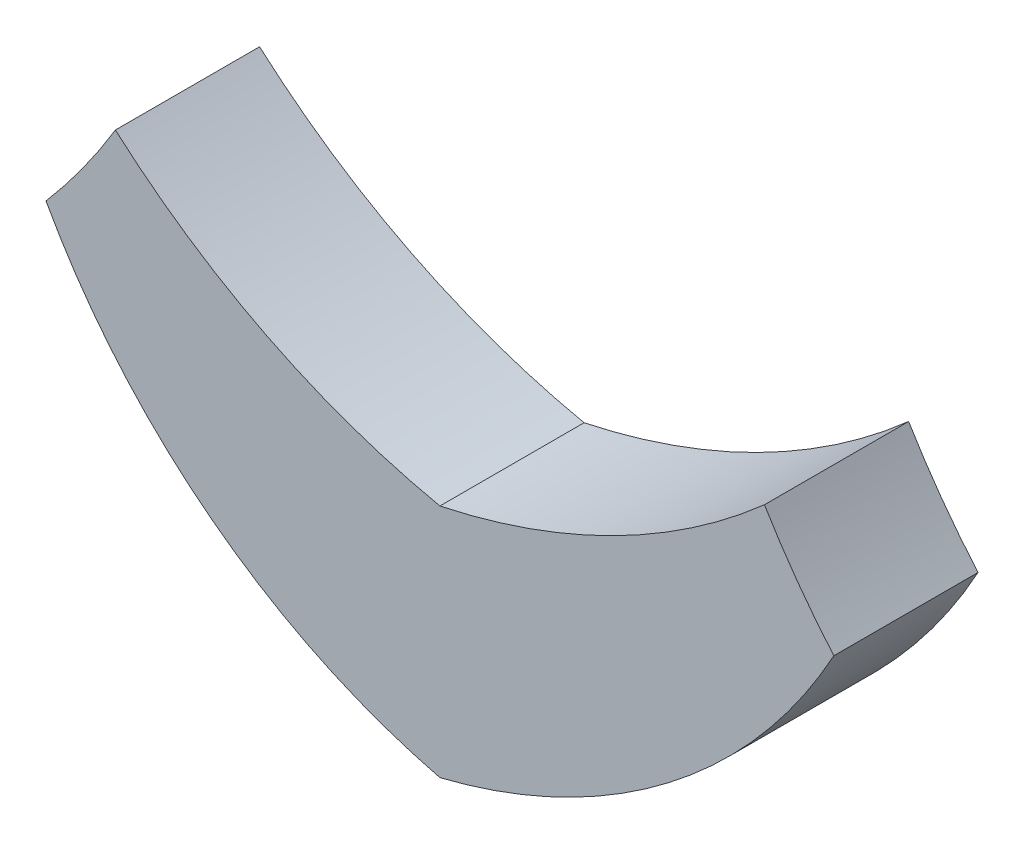
ISO-10303-21;
HEADER;
FILE_DESCRIPTION(('STEP AP214'),'2;1');
FILE_NAME('part.step','',(''),(''),'','','');
FILE_SCHEMA(('AUTOMOTIVE_DESIGN { 1 0 10303 214 1 1 1 1 }'));
ENDSEC;
DATA;
#1=APPLICATION_CONTEXT('core data for automotive mechanical design processes');
#2=APPLICATION_PROTOCOL_DEFINITION('international standard','automotive_design',2000,#1);
#3=PRODUCT_CONTEXT('',#1,'mechanical');
#4=PRODUCT('Part','Part','',(#3));
#5=PRODUCT_RELATED_PRODUCT_CATEGORY('part','',(#4));
#6=PRODUCT_DEFINITION_FORMATION('','',#4);
#7=PRODUCT_DEFINITION_CONTEXT('part definition',#1,'design');
#8=PRODUCT_DEFINITION('design','',#6,#7);
#9=PRODUCT_DEFINITION_SHAPE('','',#8);
#10=(LENGTH_UNIT() NAMED_UNIT(*) SI_UNIT(.MILLI.,.METRE.));
#11=(NAMED_UNIT(*) PLANE_ANGLE_UNIT() SI_UNIT($,.RADIAN.));
#12=(NAMED_UNIT(*) SI_UNIT($,.STERADIAN.) SOLID_ANGLE_UNIT());
#13=UNCERTAINTY_MEASURE_WITH_UNIT(LENGTH_MEASURE(1.E-05),#10,'distance_accuracy_value','');
#14=(GEOMETRIC_REPRESENTATION_CONTEXT(3) GLOBAL_UNCERTAINTY_ASSIGNED_CONTEXT((#13)) GLOBAL_UNIT_ASSIGNED_CONTEXT((#10,
#11,#12)) REPRESENTATION_CONTEXT('',''));
#15=CARTESIAN_POINT('',(0.,0.,0.));
#16=DIRECTION('',(0.,0.,1.));
#17=DIRECTION('',(1.,0.,0.));
#18=AXIS2_PLACEMENT_3D('',#15,#16,#17);
#19=CARTESIAN_POINT('',(5.80157495684048,27.9812086156926,5.));
#20=DIRECTION('',(0.,0.,-1.));
#21=DIRECTION('',(-1.,0.,0.));
#22=AXIS2_PLACEMENT_3D('',#19,#20,#21);
#23=CYLINDRICAL_SURFACE('',#22,24.7310028475838);
#24=CARTESIAN_POINT('',(5.80157495684048,27.9812086156926,0.));
#25=DIRECTION('',(0.,0.,-1.));
#26=DIRECTION('',(-1.,0.,0.));
#27=AXIS2_PLACEMENT_3D('',#24,#25,#26);
#28=CIRCLE('',#27,24.7310028475838);
#29=CARTESIAN_POINT('',(0.677245379387942,3.78691697016512,0.));
#30=VERTEX_POINT('',#29);
#31=CARTESIAN_POINT('',(-10.5771393472326,9.45122697531451,0.));
#32=VERTEX_POINT('',#31);
#33=EDGE_CURVE('E120',#30,#32,#28,.T.);
#34=ORIENTED_EDGE('',*,*,#33,.T.);
#35=DIRECTION('',(0.,0.,-1.));
#36=VECTOR('',#35,1.);
#37=CARTESIAN_POINT('',(-10.5771393472326,9.45122697531451,5.));
#38=LINE('',#37,#36);
#39=CARTESIAN_POINT('',(-10.5771393472326,9.45122697531451,5.));
#40=VERTEX_POINT('',#39);
#41=EDGE_CURVE('E41',#40,#32,#38,.T.);
#42=ORIENTED_EDGE('',*,*,#41,.F.);
#43=CARTESIAN_POINT('',(5.80157495684048,27.9812086156926,5.));
#44=DIRECTION('',(0.,0.,-1.));
#45=DIRECTION('',(1.,0.,0.));
#46=AXIS2_PLACEMENT_3D('',#43,#44,#45);
#47=CIRCLE('',#46,24.7310028475838);
#48=CARTESIAN_POINT('',(0.677245379387942,3.78691697016512,5.));
#49=VERTEX_POINT('',#48);
#50=EDGE_CURVE('E86',#49,#40,#47,.T.);
#51=ORIENTED_EDGE('',*,*,#50,.F.);
#52=DIRECTION('',(0.,0.,-1.));
#53=VECTOR('',#52,1.);
#54=CARTESIAN_POINT('',(0.677245379387942,3.78691697016512,5.));
#55=LINE('',#54,#53);
#56=EDGE_CURVE('E11',#49,#30,#55,.T.);
#57=ORIENTED_EDGE('',*,*,#56,.T.);
#58=EDGE_LOOP('',(#34,#42,#51,#57));
#59=FACE_BOUND('',#58,.T.);
#60=ADVANCED_FACE('F33',(#59),#23,.F.);
#61=CARTESIAN_POINT('',(-31.7625080797201,22.2106412845898,5.));
#62=DIRECTION('',(0.,0.,-1.));
#63=DIRECTION('',(-1.,0.,0.));
#64=AXIS2_PLACEMENT_3D('',#61,#62,#63);
#65=CYLINDRICAL_SURFACE('',#64,24.7310028475838);
#66=CARTESIAN_POINT('',(-31.7625080797201,22.2106412845898,0.));
#67=DIRECTION('',(0.,0.,-1.));
#68=DIRECTION('',(1.,0.,0.));
#69=AXIS2_PLACEMENT_3D('',#66,#67,#68);
#70=CIRCLE('',#69,24.7310028475838);
#71=CARTESIAN_POINT('',(-12.9830673875644,6.11855909684899,0.));
#72=VERTEX_POINT('',#71);
#73=EDGE_CURVE('E122',#32,#72,#70,.T.);
#74=ORIENTED_EDGE('',*,*,#73,.T.);
#75=DIRECTION('',(0.,0.,-1.));
#76=VECTOR('',#75,1.);
#77=CARTESIAN_POINT('',(-12.9830673875644,6.11855909684899,5.));
#78=LINE('',#77,#76);
#79=CARTESIAN_POINT('',(-12.9830673875644,6.11855909684899,5.));
#80=VERTEX_POINT('',#79);
#81=EDGE_CURVE('E109',#80,#72,#78,.T.);
#82=ORIENTED_EDGE('',*,*,#81,.F.);
#83=CARTESIAN_POINT('',(-31.7625080797201,22.2106412845898,5.));
#84=DIRECTION('',(0.,0.,-1.));
#85=DIRECTION('',(1.,0.,0.));
#86=AXIS2_PLACEMENT_3D('',#83,#84,#85);
#87=CIRCLE('',#86,24.7310028475838);
#88=EDGE_CURVE('E100',#40,#80,#87,.T.);
#89=ORIENTED_EDGE('',*,*,#88,.F.);
#90=ORIENTED_EDGE('',*,*,#41,.T.);
#91=EDGE_LOOP('',(#74,#82,#89,#90));
#92=FACE_BOUND('',#91,.T.);
#93=ADVANCED_FACE('F136',(#92),#65,.F.);
#94=CARTESIAN_POINT('',(5.80157495684051,16.4400739534869,5.));
#95=DIRECTION('',(0.,0.,-1.));
#96=DIRECTION('',(-1.,0.,0.));
#97=AXIS2_PLACEMENT_3D('',#94,#95,#96);
#98=CYLINDRICAL_SURFACE('',#97,21.4335358012393);
#99=CARTESIAN_POINT('',(5.80157495684051,16.4400739534869,0.));
#100=DIRECTION('',(0.,0.,1.));
#101=DIRECTION('',(1.,0.,0.));
#102=AXIS2_PLACEMENT_3D('',#99,#100,#101);
#103=CIRCLE('',#102,21.4335358012393);
#104=CARTESIAN_POINT('',(0.677245379387951,-4.37188662990482,0.));
#105=VERTEX_POINT('',#104);
#106=EDGE_CURVE('E108',#72,#105,#103,.T.);
#107=ORIENTED_EDGE('',*,*,#106,.T.);
#108=DIRECTION('',(0.,0.,-1.));
#109=VECTOR('',#108,1.);
#110=CARTESIAN_POINT('',(0.677245379387951,-4.37188662990482,5.));
#111=LINE('',#110,#109);
#112=CARTESIAN_POINT('',(0.677245379387951,-4.37188662990482,5.));
#113=VERTEX_POINT('',#112);
#114=EDGE_CURVE('E106',#113,#105,#111,.T.);
#115=ORIENTED_EDGE('',*,*,#114,.F.);
#116=CARTESIAN_POINT('',(5.80157495684051,16.4400739534869,5.));
#117=DIRECTION('',(0.,0.,1.));
#118=DIRECTION('',(-1.,0.,0.));
#119=AXIS2_PLACEMENT_3D('',#116,#117,#118);
#120=CIRCLE('',#119,21.4335358012393);
#121=EDGE_CURVE('E94',#80,#113,#120,.T.);
#122=ORIENTED_EDGE('',*,*,#121,.F.);
#123=ORIENTED_EDGE('',*,*,#81,.T.);
#124=EDGE_LOOP('',(#107,#115,#122,#123));
#125=FACE_BOUND('',#124,.T.);
#126=ADVANCED_FACE('F107',(#125),#98,.T.);
#127=CARTESIAN_POINT('',(-4.44708419806459,16.4400739534869,5.));
#128=DIRECTION('',(0.,0.,-1.));
#129=DIRECTION('',(-1.,0.,0.));
#130=AXIS2_PLACEMENT_3D('',#127,#128,#129);
#131=CYLINDRICAL_SURFACE('',#130,21.4335358012393);
#132=CARTESIAN_POINT('',(-4.44708419806459,16.4400739534869,0.));
#133=DIRECTION('',(0.,0.,1.));
#134=DIRECTION('',(1.,0.,0.));
#135=AXIS2_PLACEMENT_3D('',#132,#133,#134);
#136=CIRCLE('',#135,21.4335358012393);
#137=CARTESIAN_POINT('',(14.3375581463403,6.118559096849,0.));
#138=VERTEX_POINT('',#137);
#139=EDGE_CURVE('E72',#105,#138,#136,.T.);
#140=ORIENTED_EDGE('',*,*,#139,.T.);
#141=DIRECTION('',(0.,0.,-1.));
#142=VECTOR('',#141,1.);
#143=CARTESIAN_POINT('',(14.3375581463403,6.118559096849,5.));
#144=LINE('',#143,#142);
#145=CARTESIAN_POINT('',(14.3375581463403,6.118559096849,5.));
#146=VERTEX_POINT('',#145);
#147=EDGE_CURVE('E110',#146,#138,#144,.T.);
#148=ORIENTED_EDGE('',*,*,#147,.F.);
#149=CARTESIAN_POINT('',(-4.44708419806459,16.4400739534869,5.));
#150=DIRECTION('',(0.,0.,1.));
#151=DIRECTION('',(-1.,0.,0.));
#152=AXIS2_PLACEMENT_3D('',#149,#150,#151);
#153=CIRCLE('',#152,21.4335358012393);
#154=EDGE_CURVE('E98',#113,#146,#153,.T.);
#155=ORIENTED_EDGE('',*,*,#154,.F.);
#156=ORIENTED_EDGE('',*,*,#114,.T.);
#157=EDGE_LOOP('',(#140,#148,#155,#156));
#158=FACE_BOUND('',#157,.T.);
#159=ADVANCED_FACE('F112',(#158),#131,.T.);
#160=CARTESIAN_POINT('',(33.116998838496,22.2106412845898,5.));
#161=DIRECTION('',(0.,0.,-1.));
#162=DIRECTION('',(-1.,0.,0.));
#163=AXIS2_PLACEMENT_3D('',#160,#161,#162);
#164=CYLINDRICAL_SURFACE('',#163,24.7310028475838);
#165=CARTESIAN_POINT('',(33.116998838496,22.2106412845898,0.));
#166=DIRECTION('',(0.,0.,-1.));
#167=DIRECTION('',(-1.,0.,0.));
#168=AXIS2_PLACEMENT_3D('',#165,#166,#167);
#169=CIRCLE('',#168,24.7310028475838);
#170=CARTESIAN_POINT('',(11.9316301060085,9.4512269753145,0.));
#171=VERTEX_POINT('',#170);
#172=EDGE_CURVE('E79',#138,#171,#169,.T.);
#173=ORIENTED_EDGE('',*,*,#172,.T.);
#174=DIRECTION('',(0.,0.,-1.));
#175=VECTOR('',#174,1.);
#176=CARTESIAN_POINT('',(11.9316301060085,9.4512269753145,5.));
#177=LINE('',#176,#175);
#178=CARTESIAN_POINT('',(11.9316301060085,9.4512269753145,5.));
#179=VERTEX_POINT('',#178);
#180=EDGE_CURVE('E116',#179,#171,#177,.T.);
#181=ORIENTED_EDGE('',*,*,#180,.F.);
#182=CARTESIAN_POINT('',(33.116998838496,22.2106412845898,5.));
#183=DIRECTION('',(0.,0.,-1.));
#184=DIRECTION('',(-1.,0.,0.));
#185=AXIS2_PLACEMENT_3D('',#182,#183,#184);
#186=CIRCLE('',#185,24.7310028475838);
#187=EDGE_CURVE('E114',#146,#179,#186,.T.);
#188=ORIENTED_EDGE('',*,*,#187,.F.);
#189=ORIENTED_EDGE('',*,*,#147,.T.);
#190=EDGE_LOOP('',(#173,#181,#188,#189));
#191=FACE_BOUND('',#190,.T.);
#192=ADVANCED_FACE('F152',(#191),#164,.F.);
#193=CARTESIAN_POINT('',(-4.44708419806456,27.9812086156926,5.));
#194=DIRECTION('',(0.,0.,-1.));
#195=DIRECTION('',(-1.,0.,0.));
#196=AXIS2_PLACEMENT_3D('',#193,#194,#195);
#197=CYLINDRICAL_SURFACE('',#196,24.7310028475838);
#198=CARTESIAN_POINT('',(-4.44708419806456,27.9812086156926,0.));
#199=DIRECTION('',(0.,0.,-1.));
#200=DIRECTION('',(1.,0.,0.));
#201=AXIS2_PLACEMENT_3D('',#198,#199,#200);
#202=CIRCLE('',#201,24.7310028475838);
#203=EDGE_CURVE('E128',#171,#30,#202,.T.);
#204=ORIENTED_EDGE('',*,*,#203,.T.);
#205=ORIENTED_EDGE('',*,*,#56,.F.);
#206=CARTESIAN_POINT('',(-4.44708419806456,27.9812086156926,5.));
#207=DIRECTION('',(0.,0.,-1.));
#208=DIRECTION('',(-1.,0.,0.));
#209=AXIS2_PLACEMENT_3D('',#206,#207,#208);
#210=CIRCLE('',#209,24.7310028475838);
#211=EDGE_CURVE('E49',#179,#49,#210,.T.);
#212=ORIENTED_EDGE('',*,*,#211,.F.);
#213=ORIENTED_EDGE('',*,*,#180,.T.);
#214=EDGE_LOOP('',(#204,#205,#212,#213));
#215=FACE_BOUND('',#214,.T.);
#216=ADVANCED_FACE('F140',(#215),#197,.F.);
#217=CARTESIAN_POINT('',(0.677245379387959,27.9812086156926,5.));
#218=DIRECTION('',(0.,0.,-1.));
#219=DIRECTION('',(-1.,0.,0.));
#220=AXIS2_PLACEMENT_3D('',#217,#218,#219);
#221=PLANE('',#220);
#222=ORIENTED_EDGE('',*,*,#211,.T.);
#223=ORIENTED_EDGE('',*,*,#50,.T.);
#224=ORIENTED_EDGE('',*,*,#88,.T.);
#225=ORIENTED_EDGE('',*,*,#121,.T.);
#226=ORIENTED_EDGE('',*,*,#154,.T.);
#227=ORIENTED_EDGE('',*,*,#187,.T.);
#228=EDGE_LOOP('',(#222,#223,#224,#225,#226,#227));
#229=FACE_BOUND('',#228,.T.);
#230=ADVANCED_FACE('F96',(#229),#221,.F.);
#231=CARTESIAN_POINT('',(0.677245379387959,27.9812086156926,0.));
#232=DIRECTION('',(0.,0.,-1.));
#233=DIRECTION('',(-1.,0.,0.));
#234=AXIS2_PLACEMENT_3D('',#231,#232,#233);
#235=PLANE('',#234);
#236=ORIENTED_EDGE('',*,*,#33,.F.);
#237=ORIENTED_EDGE('',*,*,#203,.F.);
#238=ORIENTED_EDGE('',*,*,#172,.F.);
#239=ORIENTED_EDGE('',*,*,#139,.F.);
#240=ORIENTED_EDGE('',*,*,#106,.F.);
#241=ORIENTED_EDGE('',*,*,#73,.F.);
#242=EDGE_LOOP('',(#236,#237,#238,#239,#240,#241));
#243=FACE_BOUND('',#242,.T.);
#244=ADVANCED_FACE('F138',(#243),#235,.T.);
#245=CLOSED_SHELL('',(#60,#93,#126,#159,#192,#216,#230,#244));
#246=MANIFOLD_SOLID_BREP('B2',#245);
#247=ADVANCED_BREP_SHAPE_REPRESENTATION('',(#18,#246),#14);
#248=SHAPE_DEFINITION_REPRESENTATION(#9,#247);
ENDSEC;
END-ISO-10303-21;
